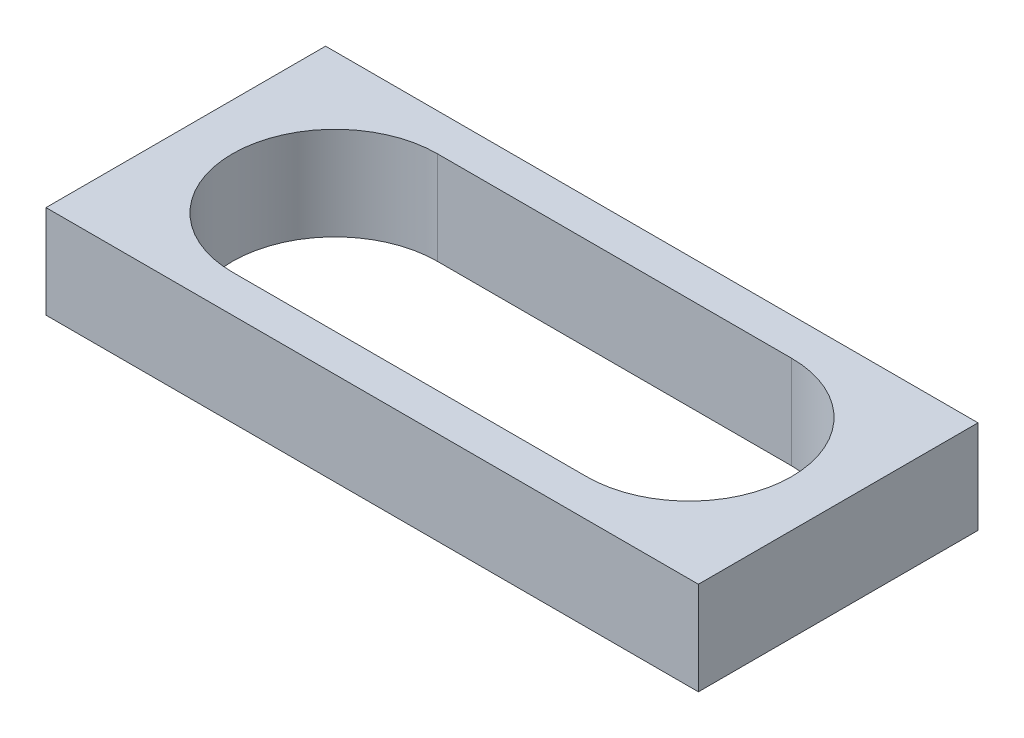
ISO-10303-21;
HEADER;
FILE_DESCRIPTION(('STEP AP214'),'2;1');
FILE_NAME('part.step','',(''),(''),'','','');
FILE_SCHEMA(('AUTOMOTIVE_DESIGN { 1 0 10303 214 1 1 1 1 }'));
ENDSEC;
DATA;
#1=APPLICATION_CONTEXT('core data for automotive mechanical design processes');
#2=APPLICATION_PROTOCOL_DEFINITION('international standard','automotive_design',2000,#1);
#3=PRODUCT_CONTEXT('',#1,'mechanical');
#4=PRODUCT('Part','Part','',(#3));
#5=PRODUCT_RELATED_PRODUCT_CATEGORY('part','',(#4));
#6=PRODUCT_DEFINITION_FORMATION('','',#4);
#7=PRODUCT_DEFINITION_CONTEXT('part definition',#1,'design');
#8=PRODUCT_DEFINITION('design','',#6,#7);
#9=PRODUCT_DEFINITION_SHAPE('','',#8);
#10=(LENGTH_UNIT() NAMED_UNIT(*) SI_UNIT(.MILLI.,.METRE.));
#11=(NAMED_UNIT(*) PLANE_ANGLE_UNIT() SI_UNIT($,.RADIAN.));
#12=(NAMED_UNIT(*) SI_UNIT($,.STERADIAN.) SOLID_ANGLE_UNIT());
#13=UNCERTAINTY_MEASURE_WITH_UNIT(LENGTH_MEASURE(1.E-05),#10,'distance_accuracy_value','');
#14=(GEOMETRIC_REPRESENTATION_CONTEXT(3) GLOBAL_UNCERTAINTY_ASSIGNED_CONTEXT((#13)) GLOBAL_UNIT_ASSIGNED_CONTEXT((#10,
#11,#12)) REPRESENTATION_CONTEXT('',''));
#15=CARTESIAN_POINT('',(0.,0.,0.));
#16=DIRECTION('',(0.,0.,1.));
#17=DIRECTION('',(1.,0.,0.));
#18=AXIS2_PLACEMENT_3D('',#15,#16,#17);
#19=CARTESIAN_POINT('',(0.,6.35,0.));
#20=DIRECTION('',(0.,-1.,0.));
#21=DIRECTION('',(0.,0.,-1.));
#22=AXIS2_PLACEMENT_3D('',#19,#20,#21);
#23=PLANE('',#22);
#24=DIRECTION('',(0.,0.,-1.));
#25=VECTOR('',#24,1.);
#26=CARTESIAN_POINT('',(22.225,6.35,9.525));
#27=LINE('',#26,#25);
#28=CARTESIAN_POINT('',(22.225,6.35,9.525));
#29=VERTEX_POINT('',#28);
#30=CARTESIAN_POINT('',(22.225,6.35,-9.525));
#31=VERTEX_POINT('',#30);
#32=EDGE_CURVE('E136',#29,#31,#27,.T.);
#33=ORIENTED_EDGE('',*,*,#32,.T.);
#34=DIRECTION('',(-1.,0.,0.));
#35=VECTOR('',#34,1.);
#36=CARTESIAN_POINT('',(-22.225,6.35,-9.525));
#37=LINE('',#36,#35);
#38=CARTESIAN_POINT('',(-22.225,6.35,-9.525));
#39=VERTEX_POINT('',#38);
#40=EDGE_CURVE('E139',#31,#39,#37,.T.);
#41=ORIENTED_EDGE('',*,*,#40,.T.);
#42=DIRECTION('',(0.,0.,1.));
#43=VECTOR('',#42,1.);
#44=CARTESIAN_POINT('',(-22.225,6.35,9.525));
#45=LINE('',#44,#43);
#46=CARTESIAN_POINT('',(-22.225,6.35,9.525));
#47=VERTEX_POINT('',#46);
#48=EDGE_CURVE('E142',#39,#47,#45,.T.);
#49=ORIENTED_EDGE('',*,*,#48,.T.);
#50=DIRECTION('',(1.,0.,0.));
#51=VECTOR('',#50,1.);
#52=CARTESIAN_POINT('',(-22.225,6.35,9.525));
#53=LINE('',#52,#51);
#54=EDGE_CURVE('E144',#47,#29,#53,.T.);
#55=ORIENTED_EDGE('',*,*,#54,.T.);
#56=EDGE_LOOP('',(#33,#41,#49,#55));
#57=FACE_BOUND('',#56,.T.);
#58=CARTESIAN_POINT('',(-12.065,6.35,0.));
#59=DIRECTION('',(0.,1.,0.));
#60=DIRECTION('',(0.,0.,1.));
#61=AXIS2_PLACEMENT_3D('',#58,#59,#60);
#62=CIRCLE('',#61,6.985);
#63=CARTESIAN_POINT('',(-12.065,6.35,-6.985));
#64=VERTEX_POINT('',#63);
#65=CARTESIAN_POINT('',(-12.065,6.35,6.985));
#66=VERTEX_POINT('',#65);
#67=EDGE_CURVE('E100',#64,#66,#62,.T.);
#68=ORIENTED_EDGE('',*,*,#67,.F.);
#69=DIRECTION('',(-1.,0.,0.));
#70=VECTOR('',#69,1.);
#71=CARTESIAN_POINT('',(-12.065,6.35,-6.985));
#72=LINE('',#71,#70);
#73=CARTESIAN_POINT('',(12.065,6.35,-6.985));
#74=VERTEX_POINT('',#73);
#75=EDGE_CURVE('E122',#74,#64,#72,.T.);
#76=ORIENTED_EDGE('',*,*,#75,.F.);
#77=CARTESIAN_POINT('',(12.065,6.35,0.));
#78=DIRECTION('',(0.,1.,0.));
#79=DIRECTION('',(0.,0.,1.));
#80=AXIS2_PLACEMENT_3D('',#77,#78,#79);
#81=CIRCLE('',#80,6.985);
#82=CARTESIAN_POINT('',(12.065,6.35,6.985));
#83=VERTEX_POINT('',#82);
#84=EDGE_CURVE('E120',#83,#74,#81,.T.);
#85=ORIENTED_EDGE('',*,*,#84,.F.);
#86=DIRECTION('',(1.,0.,0.));
#87=VECTOR('',#86,1.);
#88=CARTESIAN_POINT('',(-12.065,6.35,6.985));
#89=LINE('',#88,#87);
#90=EDGE_CURVE('E108',#66,#83,#89,.T.);
#91=ORIENTED_EDGE('',*,*,#90,.F.);
#92=EDGE_LOOP('',(#68,#76,#85,#91));
#93=FACE_BOUND('',#92,.T.);
#94=ADVANCED_FACE('F35',(#57,#93),#23,.F.);
#95=CARTESIAN_POINT('',(0.,0.,0.));
#96=DIRECTION('',(0.,-1.,0.));
#97=DIRECTION('',(0.,0.,-1.));
#98=AXIS2_PLACEMENT_3D('',#95,#96,#97);
#99=PLANE('',#98);
#100=DIRECTION('',(0.,0.,-1.));
#101=VECTOR('',#100,1.);
#102=CARTESIAN_POINT('',(22.225,0.,9.525));
#103=LINE('',#102,#101);
#104=CARTESIAN_POINT('',(22.225,0.,9.525));
#105=VERTEX_POINT('',#104);
#106=CARTESIAN_POINT('',(22.225,0.,-9.525));
#107=VERTEX_POINT('',#106);
#108=EDGE_CURVE('E116',#105,#107,#103,.T.);
#109=ORIENTED_EDGE('',*,*,#108,.F.);
#110=DIRECTION('',(1.,0.,0.));
#111=VECTOR('',#110,1.);
#112=CARTESIAN_POINT('',(-22.225,0.,9.525));
#113=LINE('',#112,#111);
#114=CARTESIAN_POINT('',(-22.225,0.,9.525));
#115=VERTEX_POINT('',#114);
#116=EDGE_CURVE('E140',#115,#105,#113,.T.);
#117=ORIENTED_EDGE('',*,*,#116,.F.);
#118=DIRECTION('',(0.,0.,1.));
#119=VECTOR('',#118,1.);
#120=CARTESIAN_POINT('',(-22.225,0.,9.525));
#121=LINE('',#120,#119);
#122=CARTESIAN_POINT('',(-22.225,0.,-9.525));
#123=VERTEX_POINT('',#122);
#124=EDGE_CURVE('E151',#123,#115,#121,.T.);
#125=ORIENTED_EDGE('',*,*,#124,.F.);
#126=DIRECTION('',(-1.,0.,0.));
#127=VECTOR('',#126,1.);
#128=CARTESIAN_POINT('',(-22.225,0.,-9.525));
#129=LINE('',#128,#127);
#130=EDGE_CURVE('E149',#107,#123,#129,.T.);
#131=ORIENTED_EDGE('',*,*,#130,.F.);
#132=EDGE_LOOP('',(#109,#117,#125,#131));
#133=FACE_BOUND('',#132,.T.);
#134=DIRECTION('',(-1.,0.,0.));
#135=VECTOR('',#134,1.);
#136=CARTESIAN_POINT('',(-12.065,0.,-6.985));
#137=LINE('',#136,#135);
#138=CARTESIAN_POINT('',(12.065,0.,-6.985));
#139=VERTEX_POINT('',#138);
#140=CARTESIAN_POINT('',(-12.065,0.,-6.985));
#141=VERTEX_POINT('',#140);
#142=EDGE_CURVE('E109',#139,#141,#137,.T.);
#143=ORIENTED_EDGE('',*,*,#142,.T.);
#144=CARTESIAN_POINT('',(-12.065,0.,0.));
#145=DIRECTION('',(0.,1.,0.));
#146=DIRECTION('',(0.,0.,1.));
#147=AXIS2_PLACEMENT_3D('',#144,#145,#146);
#148=CIRCLE('',#147,6.985);
#149=CARTESIAN_POINT('',(-12.065,0.,6.985));
#150=VERTEX_POINT('',#149);
#151=EDGE_CURVE('E58',#141,#150,#148,.T.);
#152=ORIENTED_EDGE('',*,*,#151,.T.);
#153=DIRECTION('',(1.,0.,0.));
#154=VECTOR('',#153,1.);
#155=CARTESIAN_POINT('',(-12.065,0.,6.985));
#156=LINE('',#155,#154);
#157=CARTESIAN_POINT('',(12.065,0.,6.985));
#158=VERTEX_POINT('',#157);
#159=EDGE_CURVE('E115',#150,#158,#156,.T.);
#160=ORIENTED_EDGE('',*,*,#159,.T.);
#161=CARTESIAN_POINT('',(12.065,0.,0.));
#162=DIRECTION('',(0.,1.,0.));
#163=DIRECTION('',(0.,0.,1.));
#164=AXIS2_PLACEMENT_3D('',#161,#162,#163);
#165=CIRCLE('',#164,6.985);
#166=EDGE_CURVE('E128',#158,#139,#165,.T.);
#167=ORIENTED_EDGE('',*,*,#166,.T.);
#168=EDGE_LOOP('',(#143,#152,#160,#167));
#169=FACE_BOUND('',#168,.T.);
#170=ADVANCED_FACE('F169',(#133,#169),#99,.T.);
#171=CARTESIAN_POINT('',(22.225,6.35,9.525));
#172=DIRECTION('',(-1.,0.,0.));
#173=DIRECTION('',(0.,0.,1.));
#174=AXIS2_PLACEMENT_3D('',#171,#172,#173);
#175=PLANE('',#174);
#176=ORIENTED_EDGE('',*,*,#108,.T.);
#177=DIRECTION('',(0.,-1.,0.));
#178=VECTOR('',#177,1.);
#179=CARTESIAN_POINT('',(22.225,6.35,-9.525));
#180=LINE('',#179,#178);
#181=EDGE_CURVE('E11',#31,#107,#180,.T.);
#182=ORIENTED_EDGE('',*,*,#181,.F.);
#183=ORIENTED_EDGE('',*,*,#32,.F.);
#184=DIRECTION('',(0.,-1.,0.));
#185=VECTOR('',#184,1.);
#186=CARTESIAN_POINT('',(22.225,6.35,9.525));
#187=LINE('',#186,#185);
#188=EDGE_CURVE('E146',#29,#105,#187,.T.);
#189=ORIENTED_EDGE('',*,*,#188,.T.);
#190=EDGE_LOOP('',(#176,#182,#183,#189));
#191=FACE_BOUND('',#190,.T.);
#192=ADVANCED_FACE('F37',(#191),#175,.F.);
#193=CARTESIAN_POINT('',(-22.225,6.35,-9.525));
#194=DIRECTION('',(0.,0.,1.));
#195=DIRECTION('',(1.,0.,0.));
#196=AXIS2_PLACEMENT_3D('',#193,#194,#195);
#197=PLANE('',#196);
#198=ORIENTED_EDGE('',*,*,#130,.T.);
#199=DIRECTION('',(0.,-1.,0.));
#200=VECTOR('',#199,1.);
#201=CARTESIAN_POINT('',(-22.225,6.35,-9.525));
#202=LINE('',#201,#200);
#203=EDGE_CURVE('E43',#39,#123,#202,.T.);
#204=ORIENTED_EDGE('',*,*,#203,.F.);
#205=ORIENTED_EDGE('',*,*,#40,.F.);
#206=ORIENTED_EDGE('',*,*,#181,.T.);
#207=EDGE_LOOP('',(#198,#204,#205,#206));
#208=FACE_BOUND('',#207,.T.);
#209=ADVANCED_FACE('F179',(#208),#197,.F.);
#210=CARTESIAN_POINT('',(-22.225,6.35,9.525));
#211=DIRECTION('',(1.,0.,0.));
#212=DIRECTION('',(0.,0.,-1.));
#213=AXIS2_PLACEMENT_3D('',#210,#211,#212);
#214=PLANE('',#213);
#215=ORIENTED_EDGE('',*,*,#124,.T.);
#216=DIRECTION('',(0.,-1.,0.));
#217=VECTOR('',#216,1.);
#218=CARTESIAN_POINT('',(-22.225,6.35,9.525));
#219=LINE('',#218,#217);
#220=EDGE_CURVE('E156',#47,#115,#219,.T.);
#221=ORIENTED_EDGE('',*,*,#220,.F.);
#222=ORIENTED_EDGE('',*,*,#48,.F.);
#223=ORIENTED_EDGE('',*,*,#203,.T.);
#224=EDGE_LOOP('',(#215,#221,#222,#223));
#225=FACE_BOUND('',#224,.T.);
#226=ADVANCED_FACE('F163',(#225),#214,.F.);
#227=CARTESIAN_POINT('',(-22.225,6.35,9.525));
#228=DIRECTION('',(0.,0.,-1.));
#229=DIRECTION('',(-1.,0.,0.));
#230=AXIS2_PLACEMENT_3D('',#227,#228,#229);
#231=PLANE('',#230);
#232=ORIENTED_EDGE('',*,*,#116,.T.);
#233=ORIENTED_EDGE('',*,*,#188,.F.);
#234=ORIENTED_EDGE('',*,*,#54,.F.);
#235=ORIENTED_EDGE('',*,*,#220,.T.);
#236=EDGE_LOOP('',(#232,#233,#234,#235));
#237=FACE_BOUND('',#236,.T.);
#238=ADVANCED_FACE('F173',(#237),#231,.F.);
#239=CARTESIAN_POINT('',(-12.065,6.35,0.));
#240=DIRECTION('',(0.,-1.,0.));
#241=DIRECTION('',(0.,0.,-1.));
#242=AXIS2_PLACEMENT_3D('',#239,#240,#241);
#243=CYLINDRICAL_SURFACE('',#242,6.985);
#244=ORIENTED_EDGE('',*,*,#151,.F.);
#245=DIRECTION('',(0.,-1.,0.));
#246=VECTOR('',#245,1.);
#247=CARTESIAN_POINT('',(-12.065,6.35,-6.985));
#248=LINE('',#247,#246);
#249=EDGE_CURVE('E104',#64,#141,#248,.T.);
#250=ORIENTED_EDGE('',*,*,#249,.F.);
#251=ORIENTED_EDGE('',*,*,#67,.T.);
#252=DIRECTION('',(0.,-1.,0.));
#253=VECTOR('',#252,1.);
#254=CARTESIAN_POINT('',(-12.065,6.35,6.985));
#255=LINE('',#254,#253);
#256=EDGE_CURVE('E103',#66,#150,#255,.T.);
#257=ORIENTED_EDGE('',*,*,#256,.T.);
#258=EDGE_LOOP('',(#244,#250,#251,#257));
#259=FACE_BOUND('',#258,.T.);
#260=ADVANCED_FACE('F102',(#259),#243,.F.);
#261=CARTESIAN_POINT('',(-12.065,6.35,6.985));
#262=DIRECTION('',(0.,0.,-1.));
#263=DIRECTION('',(-1.,0.,0.));
#264=AXIS2_PLACEMENT_3D('',#261,#262,#263);
#265=PLANE('',#264);
#266=ORIENTED_EDGE('',*,*,#159,.F.);
#267=ORIENTED_EDGE('',*,*,#256,.F.);
#268=ORIENTED_EDGE('',*,*,#90,.T.);
#269=DIRECTION('',(0.,-1.,0.));
#270=VECTOR('',#269,1.);
#271=CARTESIAN_POINT('',(12.065,6.35,6.985));
#272=LINE('',#271,#270);
#273=EDGE_CURVE('E117',#83,#158,#272,.T.);
#274=ORIENTED_EDGE('',*,*,#273,.T.);
#275=EDGE_LOOP('',(#266,#267,#268,#274));
#276=FACE_BOUND('',#275,.T.);
#277=ADVANCED_FACE('F112',(#276),#265,.T.);
#278=CARTESIAN_POINT('',(12.065,6.35,0.));
#279=DIRECTION('',(0.,-1.,0.));
#280=DIRECTION('',(0.,0.,-1.));
#281=AXIS2_PLACEMENT_3D('',#278,#279,#280);
#282=CYLINDRICAL_SURFACE('',#281,6.985);
#283=ORIENTED_EDGE('',*,*,#166,.F.);
#284=ORIENTED_EDGE('',*,*,#273,.F.);
#285=ORIENTED_EDGE('',*,*,#84,.T.);
#286=DIRECTION('',(0.,-1.,0.));
#287=VECTOR('',#286,1.);
#288=CARTESIAN_POINT('',(12.065,6.35,-6.985));
#289=LINE('',#288,#287);
#290=EDGE_CURVE('E50',#74,#139,#289,.T.);
#291=ORIENTED_EDGE('',*,*,#290,.T.);
#292=EDGE_LOOP('',(#283,#284,#285,#291));
#293=FACE_BOUND('',#292,.T.);
#294=ADVANCED_FACE('F202',(#293),#282,.F.);
#295=CARTESIAN_POINT('',(-12.065,6.35,-6.985));
#296=DIRECTION('',(0.,0.,1.));
#297=DIRECTION('',(1.,0.,0.));
#298=AXIS2_PLACEMENT_3D('',#295,#296,#297);
#299=PLANE('',#298);
#300=ORIENTED_EDGE('',*,*,#142,.F.);
#301=ORIENTED_EDGE('',*,*,#290,.F.);
#302=ORIENTED_EDGE('',*,*,#75,.T.);
#303=ORIENTED_EDGE('',*,*,#249,.T.);
#304=EDGE_LOOP('',(#300,#301,#302,#303));
#305=FACE_BOUND('',#304,.T.);
#306=ADVANCED_FACE('F206',(#305),#299,.T.);
#307=CLOSED_SHELL('',(#94,#170,#192,#209,#226,#238,#260,#277,#294,#306));
#308=MANIFOLD_SOLID_BREP('B2',#307);
#309=ADVANCED_BREP_SHAPE_REPRESENTATION('',(#18,#308),#14);
#310=SHAPE_DEFINITION_REPRESENTATION(#9,#309);
ENDSEC;
END-ISO-10303-21;
